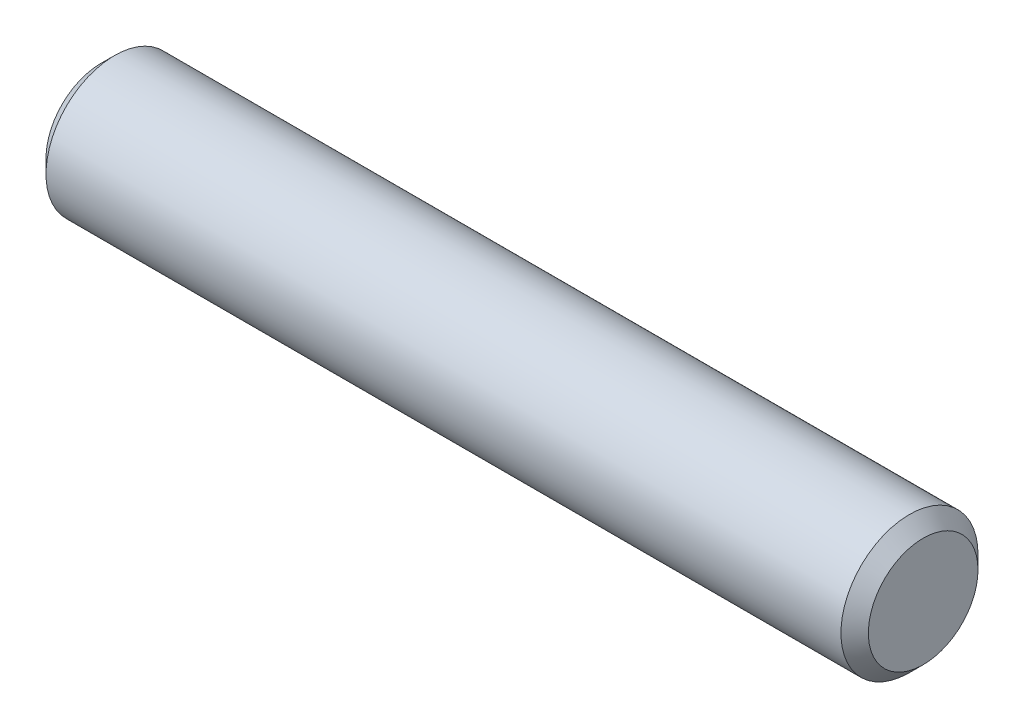
ISO-10303-21;
HEADER;
FILE_DESCRIPTION(('STEP AP214'),'2;1');
FILE_NAME('part.step','',(''),(''),'','','');
FILE_SCHEMA(('AUTOMOTIVE_DESIGN { 1 0 10303 214 1 1 1 1 }'));
ENDSEC;
DATA;
#1=APPLICATION_CONTEXT('core data for automotive mechanical design processes');
#2=APPLICATION_PROTOCOL_DEFINITION('international standard','automotive_design',2000,#1);
#3=PRODUCT_CONTEXT('',#1,'mechanical');
#4=PRODUCT('Part','Part','',(#3));
#5=PRODUCT_RELATED_PRODUCT_CATEGORY('part','',(#4));
#6=PRODUCT_DEFINITION_FORMATION('','',#4);
#7=PRODUCT_DEFINITION_CONTEXT('part definition',#1,'design');
#8=PRODUCT_DEFINITION('design','',#6,#7);
#9=PRODUCT_DEFINITION_SHAPE('','',#8);
#10=(LENGTH_UNIT() NAMED_UNIT(*) SI_UNIT(.MILLI.,.METRE.));
#11=(NAMED_UNIT(*) PLANE_ANGLE_UNIT() SI_UNIT($,.RADIAN.));
#12=(NAMED_UNIT(*) SI_UNIT($,.STERADIAN.) SOLID_ANGLE_UNIT());
#13=UNCERTAINTY_MEASURE_WITH_UNIT(LENGTH_MEASURE(1.E-05),#10,'distance_accuracy_value','');
#14=(GEOMETRIC_REPRESENTATION_CONTEXT(3) GLOBAL_UNCERTAINTY_ASSIGNED_CONTEXT((#13)) GLOBAL_UNIT_ASSIGNED_CONTEXT((#10,
#11,#12)) REPRESENTATION_CONTEXT('',''));
#15=CARTESIAN_POINT('',(0.,0.,0.));
#16=DIRECTION('',(0.,0.,1.));
#17=DIRECTION('',(1.,0.,0.));
#18=AXIS2_PLACEMENT_3D('',#15,#16,#17);
#19=CARTESIAN_POINT('',(30.,0.,0.));
#20=DIRECTION('',(-1.,0.,0.));
#21=DIRECTION('',(0.,0.,1.));
#22=AXIS2_PLACEMENT_3D('',#19,#20,#21);
#23=CYLINDRICAL_SURFACE('',#22,2.5);
#24=CARTESIAN_POINT('',(29.5,0.,0.));
#25=DIRECTION('',(1.,0.,0.));
#26=DIRECTION('',(0.,0.,-1.));
#27=AXIS2_PLACEMENT_3D('',#24,#25,#26);
#28=CIRCLE('',#27,2.5);
#29=CARTESIAN_POINT('',(29.5,0.,-2.5));
#30=VERTEX_POINT('',#29);
#31=EDGE_CURVE('E41',#30,#30,#28,.F.);
#32=ORIENTED_EDGE('',*,*,#31,.T.);
#33=EDGE_LOOP('',(#32));
#34=FACE_BOUND('',#33,.T.);
#35=CARTESIAN_POINT('',(0.500000000000007,0.,0.));
#36=DIRECTION('',(1.,0.,0.));
#37=DIRECTION('',(0.,0.,-1.));
#38=AXIS2_PLACEMENT_3D('',#35,#36,#37);
#39=CIRCLE('',#38,2.5);
#40=CARTESIAN_POINT('',(0.500000000000007,0.,-2.5));
#41=VERTEX_POINT('',#40);
#42=EDGE_CURVE('E45',#41,#41,#39,.T.);
#43=ORIENTED_EDGE('',*,*,#42,.T.);
#44=EDGE_LOOP('',(#43));
#45=FACE_BOUND('',#44,.T.);
#46=ADVANCED_FACE('F33',(#34,#45),#23,.T.);
#47=CARTESIAN_POINT('',(30.,0.,0.));
#48=DIRECTION('',(1.,0.,0.));
#49=DIRECTION('',(0.,0.,-1.));
#50=AXIS2_PLACEMENT_3D('',#47,#48,#49);
#51=PLANE('',#50);
#52=CARTESIAN_POINT('',(30.,0.,0.));
#53=DIRECTION('',(1.,0.,0.));
#54=DIRECTION('',(0.,0.,-1.));
#55=AXIS2_PLACEMENT_3D('',#52,#53,#54);
#56=CIRCLE('',#55,1.99999999999999);
#57=CARTESIAN_POINT('',(30.,0.,-1.99999999999999));
#58=VERTEX_POINT('',#57);
#59=EDGE_CURVE('E49',#58,#58,#56,.T.);
#60=ORIENTED_EDGE('',*,*,#59,.T.);
#61=EDGE_LOOP('',(#60));
#62=FACE_BOUND('',#61,.T.);
#63=ADVANCED_FACE('F55',(#62),#51,.T.);
#64=CARTESIAN_POINT('',(0.,0.,0.));
#65=DIRECTION('',(1.,0.,0.));
#66=DIRECTION('',(0.,0.,-1.));
#67=AXIS2_PLACEMENT_3D('',#64,#65,#66);
#68=PLANE('',#67);
#69=CARTESIAN_POINT('',(0.,0.,0.));
#70=DIRECTION('',(1.,0.,0.));
#71=DIRECTION('',(0.,0.,-1.));
#72=AXIS2_PLACEMENT_3D('',#69,#70,#71);
#73=CIRCLE('',#72,1.99999999999999);
#74=CARTESIAN_POINT('',(0.,0.,-1.99999999999999));
#75=VERTEX_POINT('',#74);
#76=EDGE_CURVE('E10',#75,#75,#73,.F.);
#77=ORIENTED_EDGE('',*,*,#76,.T.);
#78=EDGE_LOOP('',(#77));
#79=FACE_BOUND('',#78,.T.);
#80=ADVANCED_FACE('F59',(#79),#68,.F.);
#81=CARTESIAN_POINT('',(30.,0.,0.));
#82=DIRECTION('',(-1.,0.,0.));
#83=DIRECTION('',(0.,0.,1.));
#84=AXIS2_PLACEMENT_3D('',#81,#82,#83);
#85=CONICAL_SURFACE('',#84,1.99999999999999,0.785398163397449);
#86=ORIENTED_EDGE('',*,*,#31,.F.);
#87=EDGE_LOOP('',(#86));
#88=FACE_BOUND('',#87,.T.);
#89=ORIENTED_EDGE('',*,*,#59,.F.);
#90=EDGE_LOOP('',(#89));
#91=FACE_BOUND('',#90,.T.);
#92=ADVANCED_FACE('F57',(#88,#91),#85,.T.);
#93=CARTESIAN_POINT('',(0.500000000000007,0.,0.));
#94=DIRECTION('',(1.,0.,0.));
#95=DIRECTION('',(0.,0.,-1.));
#96=AXIS2_PLACEMENT_3D('',#93,#94,#95);
#97=CONICAL_SURFACE('',#96,2.5,0.785398163397446);
#98=ORIENTED_EDGE('',*,*,#76,.F.);
#99=EDGE_LOOP('',(#98));
#100=FACE_BOUND('',#99,.T.);
#101=ORIENTED_EDGE('',*,*,#42,.F.);
#102=EDGE_LOOP('',(#101));
#103=FACE_BOUND('',#102,.T.);
#104=ADVANCED_FACE('F36',(#100,#103),#97,.T.);
#105=CLOSED_SHELL('',(#46,#63,#80,#92,#104));
#106=MANIFOLD_SOLID_BREP('B2',#105);
#107=ADVANCED_BREP_SHAPE_REPRESENTATION('',(#18,#106),#14);
#108=SHAPE_DEFINITION_REPRESENTATION(#9,#107);
ENDSEC;
END-ISO-10303-21;
